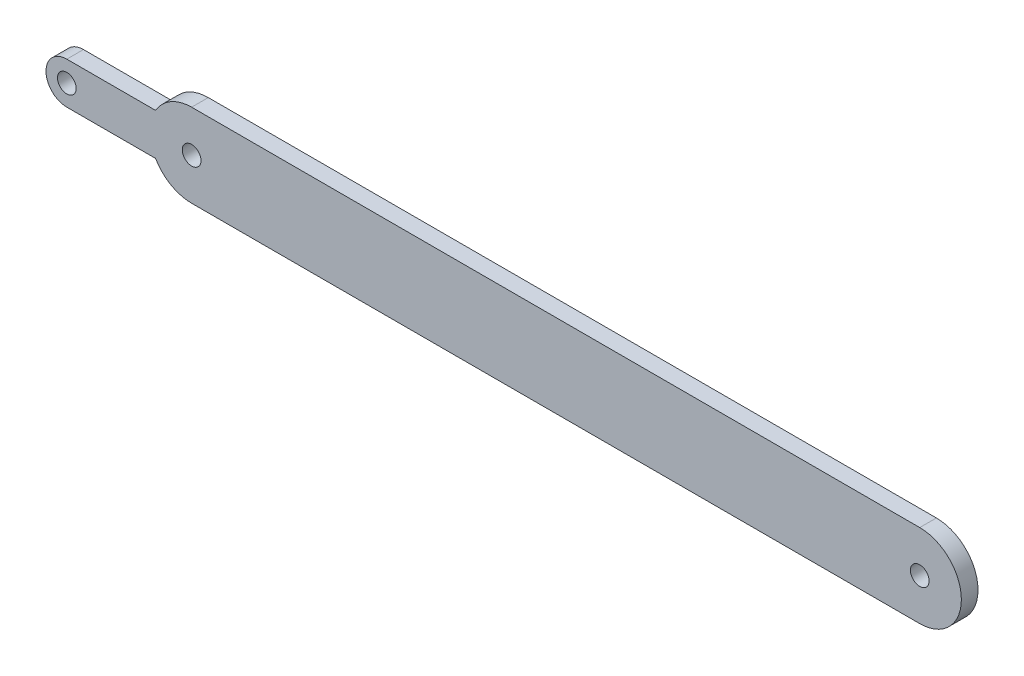
ISO-10303-21;
HEADER;
FILE_DESCRIPTION(('STEP AP214'),'2;1');
FILE_NAME('part.step','',(''),(''),'','','');
FILE_SCHEMA(('AUTOMOTIVE_DESIGN { 1 0 10303 214 1 1 1 1 }'));
ENDSEC;
DATA;
#1=APPLICATION_CONTEXT('core data for automotive mechanical design processes');
#2=APPLICATION_PROTOCOL_DEFINITION('international standard','automotive_design',2000,#1);
#3=PRODUCT_CONTEXT('',#1,'mechanical');
#4=PRODUCT('Part','Part','',(#3));
#5=PRODUCT_RELATED_PRODUCT_CATEGORY('part','',(#4));
#6=PRODUCT_DEFINITION_FORMATION('','',#4);
#7=PRODUCT_DEFINITION_CONTEXT('part definition',#1,'design');
#8=PRODUCT_DEFINITION('design','',#6,#7);
#9=PRODUCT_DEFINITION_SHAPE('','',#8);
#10=(LENGTH_UNIT() NAMED_UNIT(*) SI_UNIT(.MILLI.,.METRE.));
#11=(NAMED_UNIT(*) PLANE_ANGLE_UNIT() SI_UNIT($,.RADIAN.));
#12=(NAMED_UNIT(*) SI_UNIT($,.STERADIAN.) SOLID_ANGLE_UNIT());
#13=UNCERTAINTY_MEASURE_WITH_UNIT(LENGTH_MEASURE(1.E-05),#10,'distance_accuracy_value','');
#14=(GEOMETRIC_REPRESENTATION_CONTEXT(3) GLOBAL_UNCERTAINTY_ASSIGNED_CONTEXT((#13)) GLOBAL_UNIT_ASSIGNED_CONTEXT((#10,
#11,#12)) REPRESENTATION_CONTEXT('',''));
#15=CARTESIAN_POINT('',(0.,0.,0.));
#16=DIRECTION('',(0.,0.,1.));
#17=DIRECTION('',(1.,0.,0.));
#18=AXIS2_PLACEMENT_3D('',#15,#16,#17);
#19=CARTESIAN_POINT('',(0.,0.,2.));
#20=DIRECTION('',(0.,0.,1.));
#21=DIRECTION('',(1.,0.,0.));
#22=AXIS2_PLACEMENT_3D('',#19,#20,#21);
#23=PLANE('',#22);
#24=CARTESIAN_POINT('',(-30.,0.,2.));
#25=DIRECTION('',(0.,0.,1.));
#26=DIRECTION('',(1.,0.,0.));
#27=AXIS2_PLACEMENT_3D('',#24,#25,#26);
#28=CIRCLE('',#27,2.25);
#29=CARTESIAN_POINT('',(-27.75,0.,2.));
#30=VERTEX_POINT('',#29);
#31=EDGE_CURVE('E188',#30,#30,#28,.T.);
#32=ORIENTED_EDGE('',*,*,#31,.F.);
#33=EDGE_LOOP('',(#32));
#34=FACE_BOUND('',#33,.T.);
#35=CARTESIAN_POINT('',(0.,0.,2.));
#36=DIRECTION('',(0.,0.,1.));
#37=DIRECTION('',(1.,0.,0.));
#38=AXIS2_PLACEMENT_3D('',#35,#36,#37);
#39=CIRCLE('',#38,10.);
#40=CARTESIAN_POINT('',(0.,10.,2.));
#41=VERTEX_POINT('',#40);
#42=CARTESIAN_POINT('',(-8.66025648522948,4.99999576100229,2.));
#43=VERTEX_POINT('',#42);
#44=EDGE_CURVE('E151',#41,#43,#39,.T.);
#45=ORIENTED_EDGE('',*,*,#44,.T.);
#46=DIRECTION('',(-0.99999999999998,1.98643329819726E-07,0.));
#47=VECTOR('',#46,1.);
#48=CARTESIAN_POINT('',(-8.66025648522948,4.99999576100229,2.));
#49=LINE('',#48,#47);
#50=CARTESIAN_POINT('',(-30.,5.,2.));
#51=VERTEX_POINT('',#50);
#52=EDGE_CURVE('E99',#43,#51,#49,.T.);
#53=ORIENTED_EDGE('',*,*,#52,.T.);
#54=CARTESIAN_POINT('',(-30.,0.,2.));
#55=DIRECTION('',(0.,0.,1.));
#56=DIRECTION('',(1.,0.,0.));
#57=AXIS2_PLACEMENT_3D('',#54,#55,#56);
#58=CIRCLE('',#57,5.);
#59=CARTESIAN_POINT('',(-30.,-5.,2.));
#60=VERTEX_POINT('',#59);
#61=EDGE_CURVE('E166',#51,#60,#58,.T.);
#62=ORIENTED_EDGE('',*,*,#61,.T.);
#63=DIRECTION('',(0.999999999999982,1.91181088055908E-07,0.));
#64=VECTOR('',#63,1.);
#65=CARTESIAN_POINT('',(-8.66025639329098,-4.9999959202446,2.));
#66=LINE('',#65,#64);
#67=CARTESIAN_POINT('',(-8.66025639329098,-4.9999959202446,2.));
#68=VERTEX_POINT('',#67);
#69=EDGE_CURVE('E179',#60,#68,#66,.T.);
#70=ORIENTED_EDGE('',*,*,#69,.T.);
#71=CARTESIAN_POINT('',(0.,0.,2.));
#72=DIRECTION('',(0.,0.,1.));
#73=DIRECTION('',(1.,0.,0.));
#74=AXIS2_PLACEMENT_3D('',#71,#72,#73);
#75=CIRCLE('',#74,10.);
#76=CARTESIAN_POINT('',(0.,-10.,2.));
#77=VERTEX_POINT('',#76);
#78=EDGE_CURVE('E118',#68,#77,#75,.T.);
#79=ORIENTED_EDGE('',*,*,#78,.T.);
#80=DIRECTION('',(1.,0.,0.));
#81=VECTOR('',#80,1.);
#82=CARTESIAN_POINT('',(0.,-10.,2.));
#83=LINE('',#82,#81);
#84=CARTESIAN_POINT('',(175.,-10.,2.));
#85=VERTEX_POINT('',#84);
#86=EDGE_CURVE('E112',#77,#85,#83,.T.);
#87=ORIENTED_EDGE('',*,*,#86,.T.);
#88=CARTESIAN_POINT('',(175.,0.,2.));
#89=DIRECTION('',(0.,0.,1.));
#90=DIRECTION('',(1.,0.,0.));
#91=AXIS2_PLACEMENT_3D('',#88,#89,#90);
#92=CIRCLE('',#91,10.);
#93=CARTESIAN_POINT('',(175.,10.,2.));
#94=VERTEX_POINT('',#93);
#95=EDGE_CURVE('E116',#85,#94,#92,.T.);
#96=ORIENTED_EDGE('',*,*,#95,.T.);
#97=DIRECTION('',(-1.,0.,0.));
#98=VECTOR('',#97,1.);
#99=CARTESIAN_POINT('',(0.,10.,2.));
#100=LINE('',#99,#98);
#101=EDGE_CURVE('E56',#94,#41,#100,.T.);
#102=ORIENTED_EDGE('',*,*,#101,.T.);
#103=EDGE_LOOP('',(#45,#53,#62,#70,#79,#87,#96,#102));
#104=FACE_BOUND('',#103,.T.);
#105=CARTESIAN_POINT('',(0.,0.,2.));
#106=DIRECTION('',(0.,0.,1.));
#107=DIRECTION('',(1.,0.,0.));
#108=AXIS2_PLACEMENT_3D('',#105,#106,#107);
#109=CIRCLE('',#108,2.25);
#110=CARTESIAN_POINT('',(2.25,0.,2.));
#111=VERTEX_POINT('',#110);
#112=EDGE_CURVE('E140',#111,#111,#109,.T.);
#113=ORIENTED_EDGE('',*,*,#112,.F.);
#114=EDGE_LOOP('',(#113));
#115=FACE_BOUND('',#114,.T.);
#116=CARTESIAN_POINT('',(175.,0.,2.));
#117=DIRECTION('',(0.,0.,1.));
#118=DIRECTION('',(1.,0.,0.));
#119=AXIS2_PLACEMENT_3D('',#116,#117,#118);
#120=CIRCLE('',#119,2.25000000000001);
#121=CARTESIAN_POINT('',(177.25,0.,2.));
#122=VERTEX_POINT('',#121);
#123=EDGE_CURVE('E194',#122,#122,#120,.T.);
#124=ORIENTED_EDGE('',*,*,#123,.F.);
#125=EDGE_LOOP('',(#124));
#126=FACE_BOUND('',#125,.T.);
#127=ADVANCED_FACE('F39',(#34,#104,#115,#126),#23,.T.);
#128=CARTESIAN_POINT('',(0.,0.,-2.));
#129=DIRECTION('',(0.,0.,1.));
#130=DIRECTION('',(1.,0.,0.));
#131=AXIS2_PLACEMENT_3D('',#128,#129,#130);
#132=PLANE('',#131);
#133=CARTESIAN_POINT('',(0.,0.,-2.));
#134=DIRECTION('',(0.,0.,1.));
#135=DIRECTION('',(1.,0.,0.));
#136=AXIS2_PLACEMENT_3D('',#133,#134,#135);
#137=CIRCLE('',#136,10.);
#138=CARTESIAN_POINT('',(0.,10.,-2.));
#139=VERTEX_POINT('',#138);
#140=CARTESIAN_POINT('',(-8.66025648522948,4.99999576100229,-2.));
#141=VERTEX_POINT('',#140);
#142=EDGE_CURVE('E136',#139,#141,#137,.T.);
#143=ORIENTED_EDGE('',*,*,#142,.F.);
#144=DIRECTION('',(-1.,0.,0.));
#145=VECTOR('',#144,1.);
#146=CARTESIAN_POINT('',(0.,10.,-2.));
#147=LINE('',#146,#145);
#148=CARTESIAN_POINT('',(175.,10.,-2.));
#149=VERTEX_POINT('',#148);
#150=EDGE_CURVE('E91',#149,#139,#147,.T.);
#151=ORIENTED_EDGE('',*,*,#150,.F.);
#152=CARTESIAN_POINT('',(175.,0.,-2.));
#153=DIRECTION('',(0.,0.,1.));
#154=DIRECTION('',(1.,0.,0.));
#155=AXIS2_PLACEMENT_3D('',#152,#153,#154);
#156=CIRCLE('',#155,10.);
#157=CARTESIAN_POINT('',(175.,-10.,-2.));
#158=VERTEX_POINT('',#157);
#159=EDGE_CURVE('E85',#158,#149,#156,.T.);
#160=ORIENTED_EDGE('',*,*,#159,.F.);
#161=DIRECTION('',(1.,0.,0.));
#162=VECTOR('',#161,1.);
#163=CARTESIAN_POINT('',(0.,-10.,-2.));
#164=LINE('',#163,#162);
#165=CARTESIAN_POINT('',(0.,-10.,-2.));
#166=VERTEX_POINT('',#165);
#167=EDGE_CURVE('E126',#166,#158,#164,.T.);
#168=ORIENTED_EDGE('',*,*,#167,.F.);
#169=CARTESIAN_POINT('',(0.,0.,-2.));
#170=DIRECTION('',(0.,0.,1.));
#171=DIRECTION('',(1.,0.,0.));
#172=AXIS2_PLACEMENT_3D('',#169,#170,#171);
#173=CIRCLE('',#172,10.);
#174=CARTESIAN_POINT('',(-8.66025639329098,-4.9999959202446,-2.));
#175=VERTEX_POINT('',#174);
#176=EDGE_CURVE('E146',#175,#166,#173,.T.);
#177=ORIENTED_EDGE('',*,*,#176,.F.);
#178=DIRECTION('',(0.999999999999982,1.91181088055908E-07,0.));
#179=VECTOR('',#178,1.);
#180=CARTESIAN_POINT('',(-8.66025639329098,-4.9999959202446,-2.));
#181=LINE('',#180,#179);
#182=CARTESIAN_POINT('',(-30.,-5.,-2.));
#183=VERTEX_POINT('',#182);
#184=EDGE_CURVE('E144',#183,#175,#181,.T.);
#185=ORIENTED_EDGE('',*,*,#184,.F.);
#186=CARTESIAN_POINT('',(-30.,0.,-2.));
#187=DIRECTION('',(0.,0.,1.));
#188=DIRECTION('',(1.,0.,0.));
#189=AXIS2_PLACEMENT_3D('',#186,#187,#188);
#190=CIRCLE('',#189,5.);
#191=CARTESIAN_POINT('',(-30.,5.,-2.));
#192=VERTEX_POINT('',#191);
#193=EDGE_CURVE('E142',#192,#183,#190,.T.);
#194=ORIENTED_EDGE('',*,*,#193,.F.);
#195=DIRECTION('',(-0.99999999999998,1.98643329819726E-07,0.));
#196=VECTOR('',#195,1.);
#197=CARTESIAN_POINT('',(-8.66025648522948,4.99999576100229,-2.));
#198=LINE('',#197,#196);
#199=EDGE_CURVE('E139',#141,#192,#198,.T.);
#200=ORIENTED_EDGE('',*,*,#199,.F.);
#201=EDGE_LOOP('',(#143,#151,#160,#168,#177,#185,#194,#200));
#202=FACE_BOUND('',#201,.T.);
#203=CARTESIAN_POINT('',(0.,0.,-2.));
#204=DIRECTION('',(0.,0.,1.));
#205=DIRECTION('',(1.,0.,0.));
#206=AXIS2_PLACEMENT_3D('',#203,#204,#205);
#207=CIRCLE('',#206,2.25);
#208=CARTESIAN_POINT('',(2.25,0.,-2.));
#209=VERTEX_POINT('',#208);
#210=EDGE_CURVE('E185',#209,#209,#207,.T.);
#211=ORIENTED_EDGE('',*,*,#210,.T.);
#212=EDGE_LOOP('',(#211));
#213=FACE_BOUND('',#212,.T.);
#214=CARTESIAN_POINT('',(-30.,0.,-2.));
#215=DIRECTION('',(0.,0.,1.));
#216=DIRECTION('',(1.,0.,0.));
#217=AXIS2_PLACEMENT_3D('',#214,#215,#216);
#218=CIRCLE('',#217,2.25);
#219=CARTESIAN_POINT('',(-27.75,0.,-2.));
#220=VERTEX_POINT('',#219);
#221=EDGE_CURVE('E191',#220,#220,#218,.T.);
#222=ORIENTED_EDGE('',*,*,#221,.T.);
#223=EDGE_LOOP('',(#222));
#224=FACE_BOUND('',#223,.T.);
#225=CARTESIAN_POINT('',(175.,0.,-2.));
#226=DIRECTION('',(0.,0.,1.));
#227=DIRECTION('',(1.,0.,0.));
#228=AXIS2_PLACEMENT_3D('',#225,#226,#227);
#229=CIRCLE('',#228,2.25000000000001);
#230=CARTESIAN_POINT('',(177.25,0.,-2.));
#231=VERTEX_POINT('',#230);
#232=EDGE_CURVE('E197',#231,#231,#229,.T.);
#233=ORIENTED_EDGE('',*,*,#232,.T.);
#234=EDGE_LOOP('',(#233));
#235=FACE_BOUND('',#234,.T.);
#236=ADVANCED_FACE('F170',(#202,#213,#224,#235),#132,.F.);
#237=CARTESIAN_POINT('',(0.,0.,2.));
#238=DIRECTION('',(0.,0.,-1.));
#239=DIRECTION('',(-1.,0.,0.));
#240=AXIS2_PLACEMENT_3D('',#237,#238,#239);
#241=CYLINDRICAL_SURFACE('',#240,10.);
#242=ORIENTED_EDGE('',*,*,#142,.T.);
#243=DIRECTION('',(0.,0.,-1.));
#244=VECTOR('',#243,1.);
#245=CARTESIAN_POINT('',(-8.66025648522948,4.99999576100229,2.));
#246=LINE('',#245,#244);
#247=EDGE_CURVE('E11',#43,#141,#246,.T.);
#248=ORIENTED_EDGE('',*,*,#247,.F.);
#249=ORIENTED_EDGE('',*,*,#44,.F.);
#250=DIRECTION('',(0.,0.,-1.));
#251=VECTOR('',#250,1.);
#252=CARTESIAN_POINT('',(0.,10.,2.));
#253=LINE('',#252,#251);
#254=EDGE_CURVE('E132',#41,#139,#253,.T.);
#255=ORIENTED_EDGE('',*,*,#254,.T.);
#256=EDGE_LOOP('',(#242,#248,#249,#255));
#257=FACE_BOUND('',#256,.T.);
#258=ADVANCED_FACE('F41',(#257),#241,.T.);
#259=CARTESIAN_POINT('',(-8.66025648522948,4.99999576100229,2.));
#260=DIRECTION('',(-1.98643329819726E-07,-0.99999999999998,0.));
#261=DIRECTION('',(0.99999999999998,-1.98643329819726E-07,0.));
#262=AXIS2_PLACEMENT_3D('',#259,#260,#261);
#263=PLANE('',#262);
#264=ORIENTED_EDGE('',*,*,#199,.T.);
#265=DIRECTION('',(0.,0.,-1.));
#266=VECTOR('',#265,1.);
#267=CARTESIAN_POINT('',(-30.,5.,2.));
#268=LINE('',#267,#266);
#269=EDGE_CURVE('E48',#51,#192,#268,.T.);
#270=ORIENTED_EDGE('',*,*,#269,.F.);
#271=ORIENTED_EDGE('',*,*,#52,.F.);
#272=ORIENTED_EDGE('',*,*,#247,.T.);
#273=EDGE_LOOP('',(#264,#270,#271,#272));
#274=FACE_BOUND('',#273,.T.);
#275=ADVANCED_FACE('F230',(#274),#263,.F.);
#276=CARTESIAN_POINT('',(-30.,0.,2.));
#277=DIRECTION('',(0.,0.,-1.));
#278=DIRECTION('',(-1.,0.,0.));
#279=AXIS2_PLACEMENT_3D('',#276,#277,#278);
#280=CYLINDRICAL_SURFACE('',#279,5.);
#281=ORIENTED_EDGE('',*,*,#193,.T.);
#282=DIRECTION('',(0.,0.,-1.));
#283=VECTOR('',#282,1.);
#284=CARTESIAN_POINT('',(-30.,-5.,2.));
#285=LINE('',#284,#283);
#286=EDGE_CURVE('E158',#60,#183,#285,.T.);
#287=ORIENTED_EDGE('',*,*,#286,.F.);
#288=ORIENTED_EDGE('',*,*,#61,.F.);
#289=ORIENTED_EDGE('',*,*,#269,.T.);
#290=EDGE_LOOP('',(#281,#287,#288,#289));
#291=FACE_BOUND('',#290,.T.);
#292=ADVANCED_FACE('F164',(#291),#280,.T.);
#293=CARTESIAN_POINT('',(-8.66025639329098,-4.9999959202446,2.));
#294=DIRECTION('',(-1.91181088055908E-07,0.999999999999982,0.));
#295=DIRECTION('',(-0.999999999999982,-1.91181088055908E-07,0.));
#296=AXIS2_PLACEMENT_3D('',#293,#294,#295);
#297=PLANE('',#296);
#298=ORIENTED_EDGE('',*,*,#184,.T.);
#299=DIRECTION('',(0.,0.,-1.));
#300=VECTOR('',#299,1.);
#301=CARTESIAN_POINT('',(-8.66025639329098,-4.9999959202446,2.));
#302=LINE('',#301,#300);
#303=EDGE_CURVE('E155',#68,#175,#302,.T.);
#304=ORIENTED_EDGE('',*,*,#303,.F.);
#305=ORIENTED_EDGE('',*,*,#69,.F.);
#306=ORIENTED_EDGE('',*,*,#286,.T.);
#307=EDGE_LOOP('',(#298,#304,#305,#306));
#308=FACE_BOUND('',#307,.T.);
#309=ADVANCED_FACE('F175',(#308),#297,.F.);
#310=CARTESIAN_POINT('',(0.,0.,2.));
#311=DIRECTION('',(0.,0.,-1.));
#312=DIRECTION('',(-1.,0.,0.));
#313=AXIS2_PLACEMENT_3D('',#310,#311,#312);
#314=CYLINDRICAL_SURFACE('',#313,10.);
#315=ORIENTED_EDGE('',*,*,#176,.T.);
#316=DIRECTION('',(0.,0.,-1.));
#317=VECTOR('',#316,1.);
#318=CARTESIAN_POINT('',(0.,-10.,2.));
#319=LINE('',#318,#317);
#320=EDGE_CURVE('E127',#77,#166,#319,.T.);
#321=ORIENTED_EDGE('',*,*,#320,.F.);
#322=ORIENTED_EDGE('',*,*,#78,.F.);
#323=ORIENTED_EDGE('',*,*,#303,.T.);
#324=EDGE_LOOP('',(#315,#321,#322,#323));
#325=FACE_BOUND('',#324,.T.);
#326=ADVANCED_FACE('F178',(#325),#314,.T.);
#327=CARTESIAN_POINT('',(0.,-10.,2.));
#328=DIRECTION('',(0.,1.,0.));
#329=DIRECTION('',(-1.,0.,0.));
#330=AXIS2_PLACEMENT_3D('',#327,#328,#329);
#331=PLANE('',#330);
#332=ORIENTED_EDGE('',*,*,#167,.T.);
#333=DIRECTION('',(0.,0.,-1.));
#334=VECTOR('',#333,1.);
#335=CARTESIAN_POINT('',(175.,-10.,2.));
#336=LINE('',#335,#334);
#337=EDGE_CURVE('E123',#85,#158,#336,.T.);
#338=ORIENTED_EDGE('',*,*,#337,.F.);
#339=ORIENTED_EDGE('',*,*,#86,.F.);
#340=ORIENTED_EDGE('',*,*,#320,.T.);
#341=EDGE_LOOP('',(#332,#338,#339,#340));
#342=FACE_BOUND('',#341,.T.);
#343=ADVANCED_FACE('F124',(#342),#331,.F.);
#344=CARTESIAN_POINT('',(175.,0.,2.));
#345=DIRECTION('',(0.,0.,-1.));
#346=DIRECTION('',(-1.,0.,0.));
#347=AXIS2_PLACEMENT_3D('',#344,#345,#346);
#348=CYLINDRICAL_SURFACE('',#347,10.);
#349=ORIENTED_EDGE('',*,*,#159,.T.);
#350=DIRECTION('',(0.,0.,-1.));
#351=VECTOR('',#350,1.);
#352=CARTESIAN_POINT('',(175.,10.,2.));
#353=LINE('',#352,#351);
#354=EDGE_CURVE('E128',#94,#149,#353,.T.);
#355=ORIENTED_EDGE('',*,*,#354,.F.);
#356=ORIENTED_EDGE('',*,*,#95,.F.);
#357=ORIENTED_EDGE('',*,*,#337,.T.);
#358=EDGE_LOOP('',(#349,#355,#356,#357));
#359=FACE_BOUND('',#358,.T.);
#360=ADVANCED_FACE('F130',(#359),#348,.T.);
#361=CARTESIAN_POINT('',(0.,10.,2.));
#362=DIRECTION('',(0.,-1.,0.));
#363=DIRECTION('',(0.,0.,-1.));
#364=AXIS2_PLACEMENT_3D('',#361,#362,#363);
#365=PLANE('',#364);
#366=ORIENTED_EDGE('',*,*,#150,.T.);
#367=ORIENTED_EDGE('',*,*,#254,.F.);
#368=ORIENTED_EDGE('',*,*,#101,.F.);
#369=ORIENTED_EDGE('',*,*,#354,.T.);
#370=EDGE_LOOP('',(#366,#367,#368,#369));
#371=FACE_BOUND('',#370,.T.);
#372=ADVANCED_FACE('F218',(#371),#365,.F.);
#373=CARTESIAN_POINT('',(0.,0.,2.));
#374=DIRECTION('',(0.,0.,-1.));
#375=DIRECTION('',(-1.,0.,0.));
#376=AXIS2_PLACEMENT_3D('',#373,#374,#375);
#377=CYLINDRICAL_SURFACE('',#376,2.25);
#378=ORIENTED_EDGE('',*,*,#112,.T.);
#379=EDGE_LOOP('',(#378));
#380=FACE_BOUND('',#379,.T.);
#381=ORIENTED_EDGE('',*,*,#210,.F.);
#382=EDGE_LOOP('',(#381));
#383=FACE_BOUND('',#382,.T.);
#384=ADVANCED_FACE('F215',(#380,#383),#377,.F.);
#385=CARTESIAN_POINT('',(-30.,0.,2.));
#386=DIRECTION('',(0.,0.,-1.));
#387=DIRECTION('',(-1.,0.,0.));
#388=AXIS2_PLACEMENT_3D('',#385,#386,#387);
#389=CYLINDRICAL_SURFACE('',#388,2.25);
#390=ORIENTED_EDGE('',*,*,#31,.T.);
#391=EDGE_LOOP('',(#390));
#392=FACE_BOUND('',#391,.T.);
#393=ORIENTED_EDGE('',*,*,#221,.F.);
#394=EDGE_LOOP('',(#393));
#395=FACE_BOUND('',#394,.T.);
#396=ADVANCED_FACE('F293',(#392,#395),#389,.F.);
#397=CARTESIAN_POINT('',(175.,0.,2.));
#398=DIRECTION('',(0.,0.,-1.));
#399=DIRECTION('',(-1.,0.,0.));
#400=AXIS2_PLACEMENT_3D('',#397,#398,#399);
#401=CYLINDRICAL_SURFACE('',#400,2.25000000000001);
#402=ORIENTED_EDGE('',*,*,#123,.T.);
#403=EDGE_LOOP('',(#402));
#404=FACE_BOUND('',#403,.T.);
#405=ORIENTED_EDGE('',*,*,#232,.F.);
#406=EDGE_LOOP('',(#405));
#407=FACE_BOUND('',#406,.T.);
#408=ADVANCED_FACE('F203',(#404,#407),#401,.F.);
#409=CLOSED_SHELL('',(#127,#236,#258,#275,#292,#309,#326,#343,#360,#372,#384,#396,#408));
#410=MANIFOLD_SOLID_BREP('B2',#409);
#411=ADVANCED_BREP_SHAPE_REPRESENTATION('',(#18,#410),#14);
#412=SHAPE_DEFINITION_REPRESENTATION(#9,#411);
ENDSEC;
END-ISO-10303-21;
